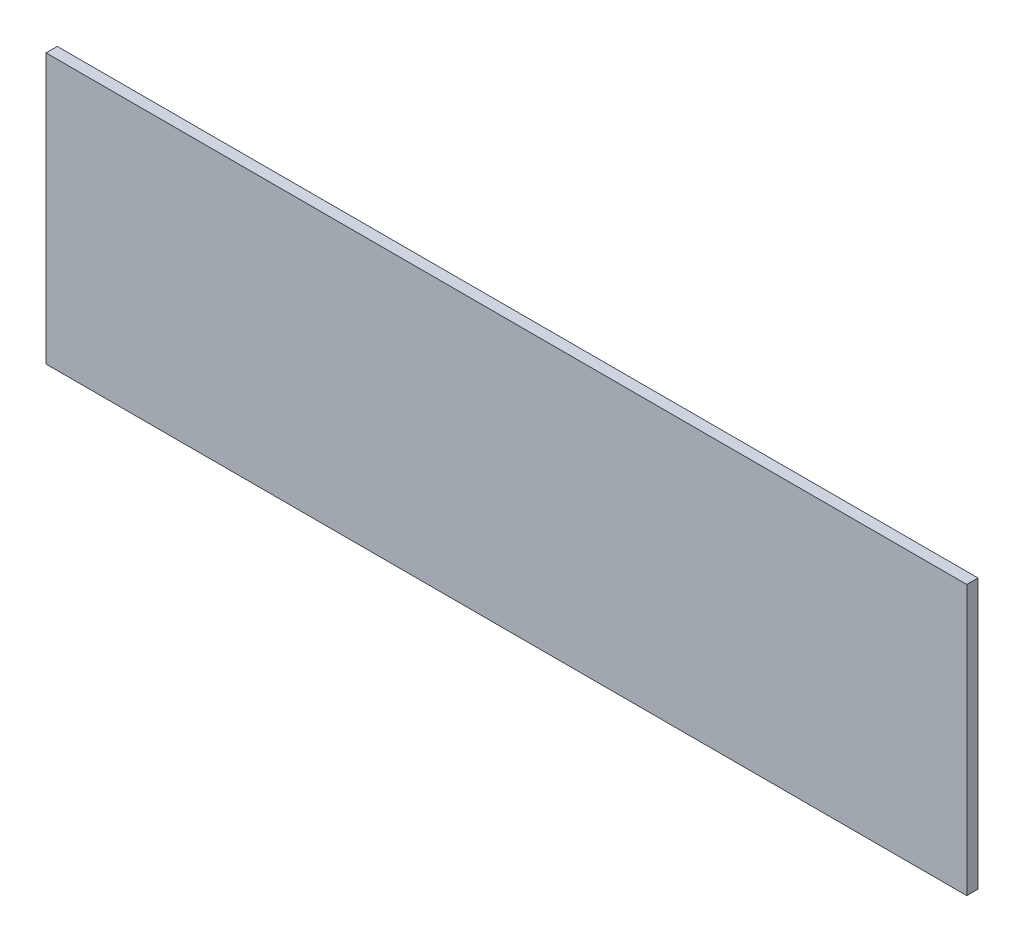
ISO-10303-21;
HEADER;
FILE_DESCRIPTION(('STEP AP214'),'2;1');
FILE_NAME('part.step','',(''),(''),'','','');
FILE_SCHEMA(('AUTOMOTIVE_DESIGN { 1 0 10303 214 1 1 1 1 }'));
ENDSEC;
DATA;
#1=APPLICATION_CONTEXT('core data for automotive mechanical design processes');
#2=APPLICATION_PROTOCOL_DEFINITION('international standard','automotive_design',2000,#1);
#3=PRODUCT_CONTEXT('',#1,'mechanical');
#4=PRODUCT('Part','Part','',(#3));
#5=PRODUCT_RELATED_PRODUCT_CATEGORY('part','',(#4));
#6=PRODUCT_DEFINITION_FORMATION('','',#4);
#7=PRODUCT_DEFINITION_CONTEXT('part definition',#1,'design');
#8=PRODUCT_DEFINITION('design','',#6,#7);
#9=PRODUCT_DEFINITION_SHAPE('','',#8);
#10=(LENGTH_UNIT() NAMED_UNIT(*) SI_UNIT(.MILLI.,.METRE.));
#11=(NAMED_UNIT(*) PLANE_ANGLE_UNIT() SI_UNIT($,.RADIAN.));
#12=(NAMED_UNIT(*) SI_UNIT($,.STERADIAN.) SOLID_ANGLE_UNIT());
#13=UNCERTAINTY_MEASURE_WITH_UNIT(LENGTH_MEASURE(1.E-05),#10,'distance_accuracy_value','');
#14=(GEOMETRIC_REPRESENTATION_CONTEXT(3) GLOBAL_UNCERTAINTY_ASSIGNED_CONTEXT((#13)) GLOBAL_UNIT_ASSIGNED_CONTEXT((#10,
#11,#12)) REPRESENTATION_CONTEXT('',''));
#15=CARTESIAN_POINT('',(0.,0.,0.));
#16=DIRECTION('',(0.,0.,1.));
#17=DIRECTION('',(1.,0.,0.));
#18=AXIS2_PLACEMENT_3D('',#15,#16,#17);
#19=CARTESIAN_POINT('',(-205.,60.,5.));
#20=DIRECTION('',(1.,0.,0.));
#21=DIRECTION('',(0.,1.,0.));
#22=AXIS2_PLACEMENT_3D('',#19,#20,#21);
#23=PLANE('',#22);
#24=DIRECTION('',(0.,-1.,0.));
#25=VECTOR('',#24,1.);
#26=CARTESIAN_POINT('',(-205.,60.,0.));
#27=LINE('',#26,#25);
#28=CARTESIAN_POINT('',(-205.,60.,0.));
#29=VERTEX_POINT('',#28);
#30=CARTESIAN_POINT('',(-205.,-60.,0.));
#31=VERTEX_POINT('',#30);
#32=EDGE_CURVE('E107',#29,#31,#27,.T.);
#33=ORIENTED_EDGE('',*,*,#32,.T.);
#34=DIRECTION('',(0.,0.,-1.));
#35=VECTOR('',#34,1.);
#36=CARTESIAN_POINT('',(-205.,-60.,5.));
#37=LINE('',#36,#35);
#38=CARTESIAN_POINT('',(-205.,-60.,5.));
#39=VERTEX_POINT('',#38);
#40=EDGE_CURVE('E11',#39,#31,#37,.T.);
#41=ORIENTED_EDGE('',*,*,#40,.F.);
#42=DIRECTION('',(0.,-1.,0.));
#43=VECTOR('',#42,1.);
#44=CARTESIAN_POINT('',(-205.,60.,5.));
#45=LINE('',#44,#43);
#46=CARTESIAN_POINT('',(-205.,60.,5.));
#47=VERTEX_POINT('',#46);
#48=EDGE_CURVE('E91',#47,#39,#45,.T.);
#49=ORIENTED_EDGE('',*,*,#48,.F.);
#50=DIRECTION('',(0.,0.,-1.));
#51=VECTOR('',#50,1.);
#52=CARTESIAN_POINT('',(-205.,60.,5.));
#53=LINE('',#52,#51);
#54=EDGE_CURVE('E103',#47,#29,#53,.T.);
#55=ORIENTED_EDGE('',*,*,#54,.T.);
#56=EDGE_LOOP('',(#33,#41,#49,#55));
#57=FACE_BOUND('',#56,.T.);
#58=ADVANCED_FACE('F39',(#57),#23,.F.);
#59=CARTESIAN_POINT('',(205.,-60.,5.));
#60=DIRECTION('',(0.,1.,0.));
#61=DIRECTION('',(-1.,0.,0.));
#62=AXIS2_PLACEMENT_3D('',#59,#60,#61);
#63=PLANE('',#62);
#64=DIRECTION('',(1.,0.,0.));
#65=VECTOR('',#64,1.);
#66=CARTESIAN_POINT('',(205.,-60.,0.));
#67=LINE('',#66,#65);
#68=CARTESIAN_POINT('',(205.,-60.,0.));
#69=VERTEX_POINT('',#68);
#70=EDGE_CURVE('E96',#31,#69,#67,.T.);
#71=ORIENTED_EDGE('',*,*,#70,.T.);
#72=DIRECTION('',(0.,0.,-1.));
#73=VECTOR('',#72,1.);
#74=CARTESIAN_POINT('',(205.,-60.,5.));
#75=LINE('',#74,#73);
#76=CARTESIAN_POINT('',(205.,-60.,5.));
#77=VERTEX_POINT('',#76);
#78=EDGE_CURVE('E48',#77,#69,#75,.T.);
#79=ORIENTED_EDGE('',*,*,#78,.F.);
#80=DIRECTION('',(1.,0.,0.));
#81=VECTOR('',#80,1.);
#82=CARTESIAN_POINT('',(205.,-60.,5.));
#83=LINE('',#82,#81);
#84=EDGE_CURVE('E86',#39,#77,#83,.T.);
#85=ORIENTED_EDGE('',*,*,#84,.F.);
#86=ORIENTED_EDGE('',*,*,#40,.T.);
#87=EDGE_LOOP('',(#71,#79,#85,#86));
#88=FACE_BOUND('',#87,.T.);
#89=ADVANCED_FACE('F95',(#88),#63,.F.);
#90=CARTESIAN_POINT('',(205.,60.,5.));
#91=DIRECTION('',(-1.,0.,0.));
#92=DIRECTION('',(0.,-1.,0.));
#93=AXIS2_PLACEMENT_3D('',#90,#91,#92);
#94=PLANE('',#93);
#95=DIRECTION('',(0.,1.,0.));
#96=VECTOR('',#95,1.);
#97=CARTESIAN_POINT('',(205.,60.,0.));
#98=LINE('',#97,#96);
#99=CARTESIAN_POINT('',(205.,60.,0.));
#100=VERTEX_POINT('',#99);
#101=EDGE_CURVE('E73',#69,#100,#98,.T.);
#102=ORIENTED_EDGE('',*,*,#101,.T.);
#103=DIRECTION('',(0.,0.,-1.));
#104=VECTOR('',#103,1.);
#105=CARTESIAN_POINT('',(205.,60.,5.));
#106=LINE('',#105,#104);
#107=CARTESIAN_POINT('',(205.,60.,5.));
#108=VERTEX_POINT('',#107);
#109=EDGE_CURVE('E98',#108,#100,#106,.T.);
#110=ORIENTED_EDGE('',*,*,#109,.F.);
#111=DIRECTION('',(0.,1.,0.));
#112=VECTOR('',#111,1.);
#113=CARTESIAN_POINT('',(205.,60.,5.));
#114=LINE('',#113,#112);
#115=EDGE_CURVE('E89',#77,#108,#114,.T.);
#116=ORIENTED_EDGE('',*,*,#115,.F.);
#117=ORIENTED_EDGE('',*,*,#78,.T.);
#118=EDGE_LOOP('',(#102,#110,#116,#117));
#119=FACE_BOUND('',#118,.T.);
#120=ADVANCED_FACE('F99',(#119),#94,.F.);
#121=CARTESIAN_POINT('',(205.,60.,5.));
#122=DIRECTION('',(0.,-1.,0.));
#123=DIRECTION('',(1.,0.,0.));
#124=AXIS2_PLACEMENT_3D('',#121,#122,#123);
#125=PLANE('',#124);
#126=DIRECTION('',(-1.,0.,0.));
#127=VECTOR('',#126,1.);
#128=CARTESIAN_POINT('',(205.,60.,0.));
#129=LINE('',#128,#127);
#130=EDGE_CURVE('E79',#100,#29,#129,.T.);
#131=ORIENTED_EDGE('',*,*,#130,.T.);
#132=ORIENTED_EDGE('',*,*,#54,.F.);
#133=DIRECTION('',(-1.,0.,0.));
#134=VECTOR('',#133,1.);
#135=CARTESIAN_POINT('',(205.,60.,5.));
#136=LINE('',#135,#134);
#137=EDGE_CURVE('E56',#108,#47,#136,.T.);
#138=ORIENTED_EDGE('',*,*,#137,.F.);
#139=ORIENTED_EDGE('',*,*,#109,.T.);
#140=EDGE_LOOP('',(#131,#132,#138,#139));
#141=FACE_BOUND('',#140,.T.);
#142=ADVANCED_FACE('F120',(#141),#125,.F.);
#143=CARTESIAN_POINT('',(0.,0.,5.));
#144=DIRECTION('',(0.,0.,-1.));
#145=DIRECTION('',(-1.,0.,0.));
#146=AXIS2_PLACEMENT_3D('',#143,#144,#145);
#147=PLANE('',#146);
#148=ORIENTED_EDGE('',*,*,#48,.T.);
#149=ORIENTED_EDGE('',*,*,#84,.T.);
#150=ORIENTED_EDGE('',*,*,#115,.T.);
#151=ORIENTED_EDGE('',*,*,#137,.T.);
#152=EDGE_LOOP('',(#148,#149,#150,#151));
#153=FACE_BOUND('',#152,.T.);
#154=ADVANCED_FACE('F87',(#153),#147,.F.);
#155=CARTESIAN_POINT('',(0.,0.,0.));
#156=DIRECTION('',(0.,0.,-1.));
#157=DIRECTION('',(-1.,0.,0.));
#158=AXIS2_PLACEMENT_3D('',#155,#156,#157);
#159=PLANE('',#158);
#160=ORIENTED_EDGE('',*,*,#32,.F.);
#161=ORIENTED_EDGE('',*,*,#130,.F.);
#162=ORIENTED_EDGE('',*,*,#101,.F.);
#163=ORIENTED_EDGE('',*,*,#70,.F.);
#164=EDGE_LOOP('',(#160,#161,#162,#163));
#165=FACE_BOUND('',#164,.T.);
#166=ADVANCED_FACE('F123',(#165),#159,.T.);
#167=CLOSED_SHELL('',(#58,#89,#120,#142,#154,#166));
#168=MANIFOLD_SOLID_BREP('B2',#167);
#169=ADVANCED_BREP_SHAPE_REPRESENTATION('',(#18,#168),#14);
#170=SHAPE_DEFINITION_REPRESENTATION(#9,#169);
ENDSEC;
END-ISO-10303-21;
